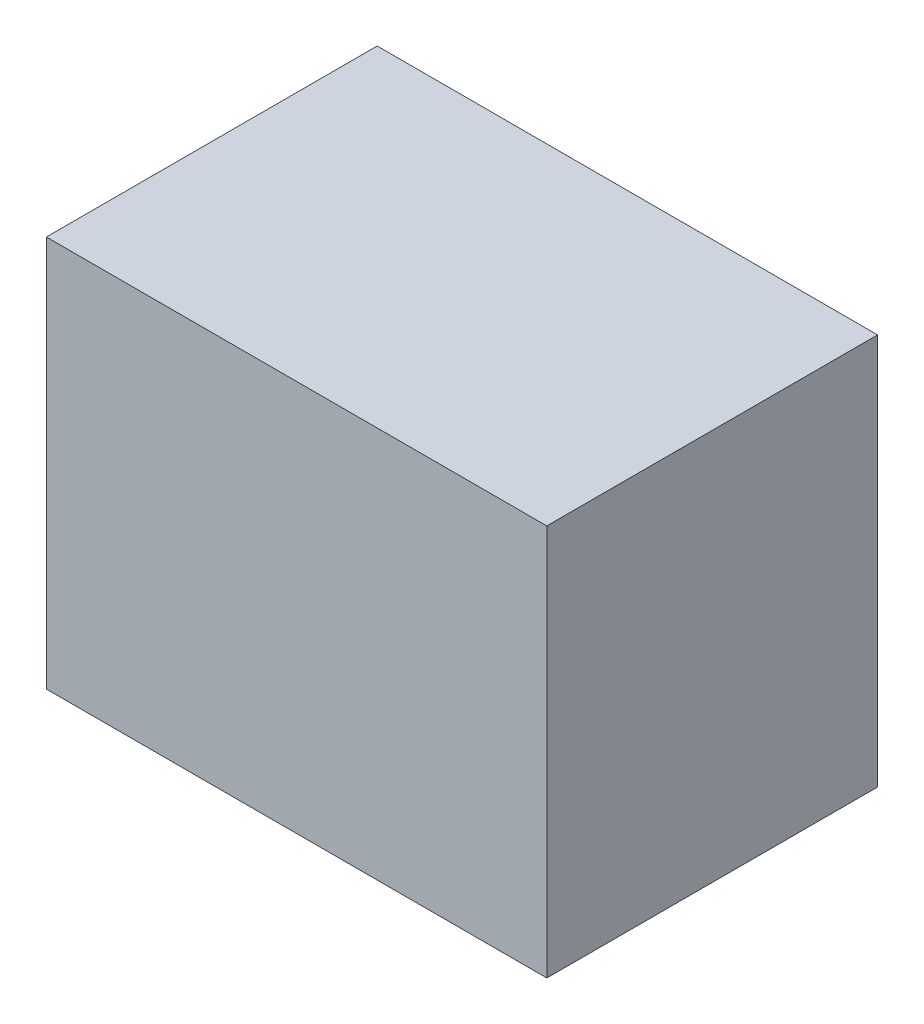
ISO-10303-21;
HEADER;
FILE_DESCRIPTION(('STEP AP214'),'2;1');
FILE_NAME('part.step','',(''),(''),'','','');
FILE_SCHEMA(('AUTOMOTIVE_DESIGN { 1 0 10303 214 1 1 1 1 }'));
ENDSEC;
DATA;
#1=APPLICATION_CONTEXT('core data for automotive mechanical design processes');
#2=APPLICATION_PROTOCOL_DEFINITION('international standard','automotive_design',2000,#1);
#3=PRODUCT_CONTEXT('',#1,'mechanical');
#4=PRODUCT('Part','Part','',(#3));
#5=PRODUCT_RELATED_PRODUCT_CATEGORY('part','',(#4));
#6=PRODUCT_DEFINITION_FORMATION('','',#4);
#7=PRODUCT_DEFINITION_CONTEXT('part definition',#1,'design');
#8=PRODUCT_DEFINITION('design','',#6,#7);
#9=PRODUCT_DEFINITION_SHAPE('','',#8);
#10=(LENGTH_UNIT() NAMED_UNIT(*) SI_UNIT(.MILLI.,.METRE.));
#11=(NAMED_UNIT(*) PLANE_ANGLE_UNIT() SI_UNIT($,.RADIAN.));
#12=(NAMED_UNIT(*) SI_UNIT($,.STERADIAN.) SOLID_ANGLE_UNIT());
#13=UNCERTAINTY_MEASURE_WITH_UNIT(LENGTH_MEASURE(1.E-05),#10,'distance_accuracy_value','');
#14=(GEOMETRIC_REPRESENTATION_CONTEXT(3) GLOBAL_UNCERTAINTY_ASSIGNED_CONTEXT((#13)) GLOBAL_UNIT_ASSIGNED_CONTEXT((#10,
#11,#12)) REPRESENTATION_CONTEXT('',''));
#15=CARTESIAN_POINT('',(0.,0.,0.));
#16=DIRECTION('',(0.,0.,1.));
#17=DIRECTION('',(1.,0.,0.));
#18=AXIS2_PLACEMENT_3D('',#15,#16,#17);
#19=CARTESIAN_POINT('',(-54.1413390339871,558.596084673297,501.65));
#20=DIRECTION('',(1.,0.,0.));
#21=DIRECTION('',(0.,1.,0.));
#22=AXIS2_PLACEMENT_3D('',#19,#20,#21);
#23=PLANE('',#22);
#24=DIRECTION('',(0.,-1.,0.));
#25=VECTOR('',#24,1.);
#26=CARTESIAN_POINT('',(-54.1413390339871,558.596084673297,0.));
#27=LINE('',#26,#25);
#28=CARTESIAN_POINT('',(-54.1413390339871,558.596084673297,0.));
#29=VERTEX_POINT('',#28);
#30=CARTESIAN_POINT('',(-54.141339033987,-35.1289153267032,0.));
#31=VERTEX_POINT('',#30);
#32=EDGE_CURVE('E96',#29,#31,#27,.T.);
#33=ORIENTED_EDGE('',*,*,#32,.T.);
#34=DIRECTION('',(0.,0.,-1.));
#35=VECTOR('',#34,1.);
#36=CARTESIAN_POINT('',(-54.141339033987,-35.1289153267032,501.65));
#37=LINE('',#36,#35);
#38=CARTESIAN_POINT('',(-54.141339033987,-35.1289153267032,501.65));
#39=VERTEX_POINT('',#38);
#40=EDGE_CURVE('E11',#39,#31,#37,.T.);
#41=ORIENTED_EDGE('',*,*,#40,.F.);
#42=DIRECTION('',(0.,-1.,0.));
#43=VECTOR('',#42,1.);
#44=CARTESIAN_POINT('',(-54.1413390339871,558.596084673297,501.65));
#45=LINE('',#44,#43);
#46=CARTESIAN_POINT('',(-54.1413390339871,558.596084673297,501.65));
#47=VERTEX_POINT('',#46);
#48=EDGE_CURVE('E84',#47,#39,#45,.T.);
#49=ORIENTED_EDGE('',*,*,#48,.F.);
#50=DIRECTION('',(0.,0.,-1.));
#51=VECTOR('',#50,1.);
#52=CARTESIAN_POINT('',(-54.1413390339871,558.596084673297,501.65));
#53=LINE('',#52,#51);
#54=EDGE_CURVE('E92',#47,#29,#53,.T.);
#55=ORIENTED_EDGE('',*,*,#54,.T.);
#56=EDGE_LOOP('',(#33,#41,#49,#55));
#57=FACE_BOUND('',#56,.T.);
#58=ADVANCED_FACE('F33',(#57),#23,.F.);
#59=CARTESIAN_POINT('',(-54.141339033987,-35.1289153267032,501.65));
#60=DIRECTION('',(0.,1.,0.));
#61=DIRECTION('',(0.,0.,1.));
#62=AXIS2_PLACEMENT_3D('',#59,#60,#61);
#63=PLANE('',#62);
#64=DIRECTION('',(1.,0.,0.));
#65=VECTOR('',#64,1.);
#66=CARTESIAN_POINT('',(-54.141339033987,-35.1289153267032,0.));
#67=LINE('',#66,#65);
#68=CARTESIAN_POINT('',(704.683660966013,-35.1289153267032,0.));
#69=VERTEX_POINT('',#68);
#70=EDGE_CURVE('E88',#31,#69,#67,.T.);
#71=ORIENTED_EDGE('',*,*,#70,.T.);
#72=DIRECTION('',(0.,0.,-1.));
#73=VECTOR('',#72,1.);
#74=CARTESIAN_POINT('',(704.683660966013,-35.1289153267032,501.65));
#75=LINE('',#74,#73);
#76=CARTESIAN_POINT('',(704.683660966013,-35.1289153267032,501.65));
#77=VERTEX_POINT('',#76);
#78=EDGE_CURVE('E41',#77,#69,#75,.T.);
#79=ORIENTED_EDGE('',*,*,#78,.F.);
#80=DIRECTION('',(1.,0.,0.));
#81=VECTOR('',#80,1.);
#82=CARTESIAN_POINT('',(-54.141339033987,-35.1289153267032,501.65));
#83=LINE('',#82,#81);
#84=EDGE_CURVE('E79',#39,#77,#83,.T.);
#85=ORIENTED_EDGE('',*,*,#84,.F.);
#86=ORIENTED_EDGE('',*,*,#40,.T.);
#87=EDGE_LOOP('',(#71,#79,#85,#86));
#88=FACE_BOUND('',#87,.T.);
#89=ADVANCED_FACE('F87',(#88),#63,.F.);
#90=CARTESIAN_POINT('',(704.683660966013,558.596084673297,501.65));
#91=DIRECTION('',(-1.,0.,0.));
#92=DIRECTION('',(0.,-1.,0.));
#93=AXIS2_PLACEMENT_3D('',#90,#91,#92);
#94=PLANE('',#93);
#95=DIRECTION('',(0.,1.,0.));
#96=VECTOR('',#95,1.);
#97=CARTESIAN_POINT('',(704.683660966013,558.596084673297,0.));
#98=LINE('',#97,#96);
#99=CARTESIAN_POINT('',(704.683660966013,558.596084673297,0.));
#100=VERTEX_POINT('',#99);
#101=EDGE_CURVE('E66',#69,#100,#98,.T.);
#102=ORIENTED_EDGE('',*,*,#101,.T.);
#103=DIRECTION('',(0.,0.,-1.));
#104=VECTOR('',#103,1.);
#105=CARTESIAN_POINT('',(704.683660966013,558.596084673297,501.65));
#106=LINE('',#105,#104);
#107=CARTESIAN_POINT('',(704.683660966013,558.596084673297,501.65));
#108=VERTEX_POINT('',#107);
#109=EDGE_CURVE('E89',#108,#100,#106,.T.);
#110=ORIENTED_EDGE('',*,*,#109,.F.);
#111=DIRECTION('',(0.,1.,0.));
#112=VECTOR('',#111,1.);
#113=CARTESIAN_POINT('',(704.683660966013,558.596084673297,501.65));
#114=LINE('',#113,#112);
#115=EDGE_CURVE('E82',#77,#108,#114,.T.);
#116=ORIENTED_EDGE('',*,*,#115,.F.);
#117=ORIENTED_EDGE('',*,*,#78,.T.);
#118=EDGE_LOOP('',(#102,#110,#116,#117));
#119=FACE_BOUND('',#118,.T.);
#120=ADVANCED_FACE('F90',(#119),#94,.F.);
#121=CARTESIAN_POINT('',(-54.1413390339871,558.596084673297,501.65));
#122=DIRECTION('',(0.,-1.,0.));
#123=DIRECTION('',(0.,0.,-1.));
#124=AXIS2_PLACEMENT_3D('',#121,#122,#123);
#125=PLANE('',#124);
#126=DIRECTION('',(-1.,0.,0.));
#127=VECTOR('',#126,1.);
#128=CARTESIAN_POINT('',(-54.1413390339871,558.596084673297,0.));
#129=LINE('',#128,#127);
#130=EDGE_CURVE('E72',#100,#29,#129,.T.);
#131=ORIENTED_EDGE('',*,*,#130,.T.);
#132=ORIENTED_EDGE('',*,*,#54,.F.);
#133=DIRECTION('',(-1.,0.,0.));
#134=VECTOR('',#133,1.);
#135=CARTESIAN_POINT('',(-54.1413390339871,558.596084673297,501.65));
#136=LINE('',#135,#134);
#137=EDGE_CURVE('E49',#108,#47,#136,.T.);
#138=ORIENTED_EDGE('',*,*,#137,.F.);
#139=ORIENTED_EDGE('',*,*,#109,.T.);
#140=EDGE_LOOP('',(#131,#132,#138,#139));
#141=FACE_BOUND('',#140,.T.);
#142=ADVANCED_FACE('F103',(#141),#125,.F.);
#143=CARTESIAN_POINT('',(0.,0.,501.65));
#144=DIRECTION('',(0.,0.,1.));
#145=DIRECTION('',(1.,0.,0.));
#146=AXIS2_PLACEMENT_3D('',#143,#144,#145);
#147=PLANE('',#146);
#148=ORIENTED_EDGE('',*,*,#48,.T.);
#149=ORIENTED_EDGE('',*,*,#84,.T.);
#150=ORIENTED_EDGE('',*,*,#115,.T.);
#151=ORIENTED_EDGE('',*,*,#137,.T.);
#152=EDGE_LOOP('',(#148,#149,#150,#151));
#153=FACE_BOUND('',#152,.T.);
#154=ADVANCED_FACE('F80',(#153),#147,.T.);
#155=CARTESIAN_POINT('',(0.,0.,0.));
#156=DIRECTION('',(0.,0.,1.));
#157=DIRECTION('',(1.,0.,0.));
#158=AXIS2_PLACEMENT_3D('',#155,#156,#157);
#159=PLANE('',#158);
#160=ORIENTED_EDGE('',*,*,#32,.F.);
#161=ORIENTED_EDGE('',*,*,#130,.F.);
#162=ORIENTED_EDGE('',*,*,#101,.F.);
#163=ORIENTED_EDGE('',*,*,#70,.F.);
#164=EDGE_LOOP('',(#160,#161,#162,#163));
#165=FACE_BOUND('',#164,.T.);
#166=ADVANCED_FACE('F106',(#165),#159,.F.);
#167=CLOSED_SHELL('',(#58,#89,#120,#142,#154,#166));
#168=MANIFOLD_SOLID_BREP('B2',#167);
#169=ADVANCED_BREP_SHAPE_REPRESENTATION('',(#18,#168),#14);
#170=SHAPE_DEFINITION_REPRESENTATION(#9,#169);
ENDSEC;
END-ISO-10303-21;
